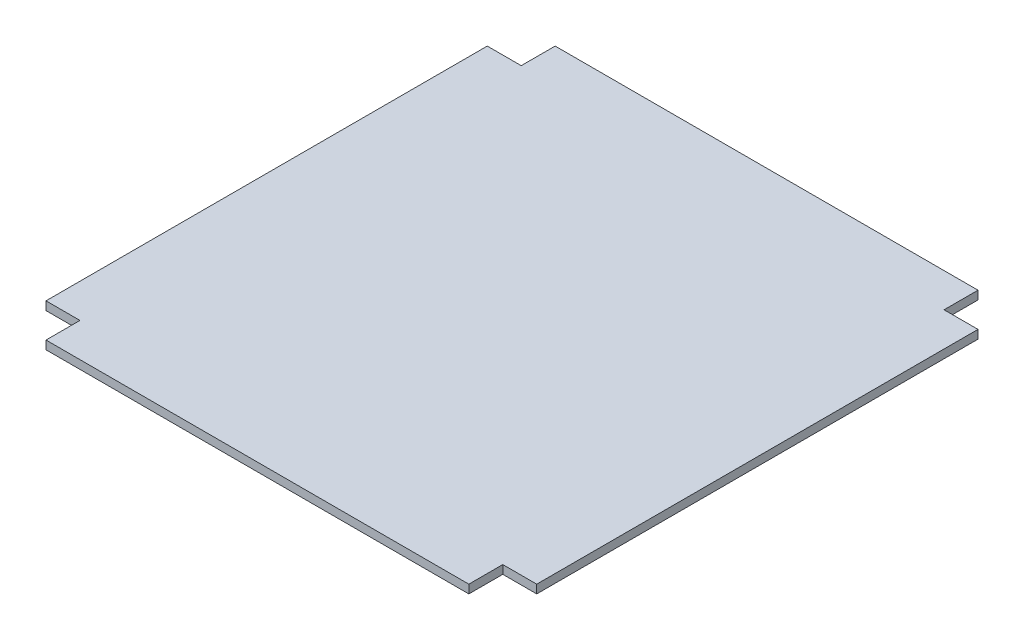
ISO-10303-21;
HEADER;
FILE_DESCRIPTION(('STEP AP214'),'2;1');
FILE_NAME('part.step','',(''),(''),'','','');
FILE_SCHEMA(('AUTOMOTIVE_DESIGN { 1 0 10303 214 1 1 1 1 }'));
ENDSEC;
DATA;
#1=APPLICATION_CONTEXT('core data for automotive mechanical design processes');
#2=APPLICATION_PROTOCOL_DEFINITION('international standard','automotive_design',2000,#1);
#3=PRODUCT_CONTEXT('',#1,'mechanical');
#4=PRODUCT('Part','Part','',(#3));
#5=PRODUCT_RELATED_PRODUCT_CATEGORY('part','',(#4));
#6=PRODUCT_DEFINITION_FORMATION('','',#4);
#7=PRODUCT_DEFINITION_CONTEXT('part definition',#1,'design');
#8=PRODUCT_DEFINITION('design','',#6,#7);
#9=PRODUCT_DEFINITION_SHAPE('','',#8);
#10=(LENGTH_UNIT() NAMED_UNIT(*) SI_UNIT(.MILLI.,.METRE.));
#11=(NAMED_UNIT(*) PLANE_ANGLE_UNIT() SI_UNIT($,.RADIAN.));
#12=(NAMED_UNIT(*) SI_UNIT($,.STERADIAN.) SOLID_ANGLE_UNIT());
#13=UNCERTAINTY_MEASURE_WITH_UNIT(LENGTH_MEASURE(1.E-05),#10,'distance_accuracy_value','');
#14=(GEOMETRIC_REPRESENTATION_CONTEXT(3) GLOBAL_UNCERTAINTY_ASSIGNED_CONTEXT((#13)) GLOBAL_UNIT_ASSIGNED_CONTEXT((#10,
#11,#12)) REPRESENTATION_CONTEXT('',''));
#15=CARTESIAN_POINT('',(0.,0.,0.));
#16=DIRECTION('',(0.,0.,1.));
#17=DIRECTION('',(1.,0.,0.));
#18=AXIS2_PLACEMENT_3D('',#15,#16,#17);
#19=CARTESIAN_POINT('',(-144.56832294801,5.,0.));
#20=DIRECTION('',(-1.,0.,0.));
#21=DIRECTION('',(0.,0.,1.));
#22=AXIS2_PLACEMENT_3D('',#19,#20,#21);
#23=PLANE('',#22);
#24=DIRECTION('',(0.,0.,-1.));
#25=VECTOR('',#24,1.);
#26=CARTESIAN_POINT('',(-144.56832294801,0.,0.));
#27=LINE('',#26,#25);
#28=CARTESIAN_POINT('',(-144.56832294801,0.,130.));
#29=VERTEX_POINT('',#28);
#30=CARTESIAN_POINT('',(-144.56832294801,0.,-130.));
#31=VERTEX_POINT('',#30);
#32=EDGE_CURVE('E163',#29,#31,#27,.T.);
#33=ORIENTED_EDGE('',*,*,#32,.F.);
#34=DIRECTION('',(0.,-1.,0.));
#35=VECTOR('',#34,1.);
#36=CARTESIAN_POINT('',(-144.56832294801,5.,130.));
#37=LINE('',#36,#35);
#38=CARTESIAN_POINT('',(-144.56832294801,5.,130.));
#39=VERTEX_POINT('',#38);
#40=EDGE_CURVE('E11',#39,#29,#37,.T.);
#41=ORIENTED_EDGE('',*,*,#40,.F.);
#42=DIRECTION('',(0.,0.,-1.));
#43=VECTOR('',#42,1.);
#44=CARTESIAN_POINT('',(-144.56832294801,5.,0.));
#45=LINE('',#44,#43);
#46=CARTESIAN_POINT('',(-144.56832294801,5.,-130.));
#47=VERTEX_POINT('',#46);
#48=EDGE_CURVE('E205',#39,#47,#45,.T.);
#49=ORIENTED_EDGE('',*,*,#48,.T.);
#50=DIRECTION('',(0.,-1.,0.));
#51=VECTOR('',#50,1.);
#52=CARTESIAN_POINT('',(-144.56832294801,5.,-130.));
#53=LINE('',#52,#51);
#54=EDGE_CURVE('E58',#47,#31,#53,.T.);
#55=ORIENTED_EDGE('',*,*,#54,.T.);
#56=EDGE_LOOP('',(#33,#41,#49,#55));
#57=FACE_BOUND('',#56,.T.);
#58=ADVANCED_FACE('F41',(#57),#23,.T.);
#59=CARTESIAN_POINT('',(0.,5.,130.));
#60=DIRECTION('',(0.,0.,-1.));
#61=DIRECTION('',(-1.,0.,0.));
#62=AXIS2_PLACEMENT_3D('',#59,#60,#61);
#63=PLANE('',#62);
#64=DIRECTION('',(1.,0.,0.));
#65=VECTOR('',#64,1.);
#66=CARTESIAN_POINT('',(0.,0.,130.));
#67=LINE('',#66,#65);
#68=CARTESIAN_POINT('',(-124.56832294801,0.,130.));
#69=VERTEX_POINT('',#68);
#70=EDGE_CURVE('E166',#29,#69,#67,.T.);
#71=ORIENTED_EDGE('',*,*,#70,.T.);
#72=DIRECTION('',(0.,-1.,0.));
#73=VECTOR('',#72,1.);
#74=CARTESIAN_POINT('',(-124.56832294801,5.,130.));
#75=LINE('',#74,#73);
#76=CARTESIAN_POINT('',(-124.56832294801,5.,130.));
#77=VERTEX_POINT('',#76);
#78=EDGE_CURVE('E50',#77,#69,#75,.T.);
#79=ORIENTED_EDGE('',*,*,#78,.F.);
#80=DIRECTION('',(1.,0.,0.));
#81=VECTOR('',#80,1.);
#82=CARTESIAN_POINT('',(0.,5.,130.));
#83=LINE('',#82,#81);
#84=EDGE_CURVE('E259',#39,#77,#83,.T.);
#85=ORIENTED_EDGE('',*,*,#84,.F.);
#86=ORIENTED_EDGE('',*,*,#40,.T.);
#87=EDGE_LOOP('',(#71,#79,#85,#86));
#88=FACE_BOUND('',#87,.T.);
#89=ADVANCED_FACE('F294',(#88),#63,.F.);
#90=CARTESIAN_POINT('',(-124.56832294801,5.,0.));
#91=DIRECTION('',(1.,0.,0.));
#92=DIRECTION('',(0.,0.,-1.));
#93=AXIS2_PLACEMENT_3D('',#90,#91,#92);
#94=PLANE('',#93);
#95=DIRECTION('',(0.,0.,1.));
#96=VECTOR('',#95,1.);
#97=CARTESIAN_POINT('',(-124.56832294801,0.,0.));
#98=LINE('',#97,#96);
#99=CARTESIAN_POINT('',(-124.56832294801,0.,150.));
#100=VERTEX_POINT('',#99);
#101=EDGE_CURVE('E169',#69,#100,#98,.T.);
#102=ORIENTED_EDGE('',*,*,#101,.T.);
#103=DIRECTION('',(0.,-1.,0.));
#104=VECTOR('',#103,1.);
#105=CARTESIAN_POINT('',(-124.56832294801,5.,150.));
#106=LINE('',#105,#104);
#107=CARTESIAN_POINT('',(-124.56832294801,5.,150.));
#108=VERTEX_POINT('',#107);
#109=EDGE_CURVE('E228',#108,#100,#106,.T.);
#110=ORIENTED_EDGE('',*,*,#109,.F.);
#111=DIRECTION('',(0.,0.,1.));
#112=VECTOR('',#111,1.);
#113=CARTESIAN_POINT('',(-124.56832294801,5.,0.));
#114=LINE('',#113,#112);
#115=EDGE_CURVE('E238',#77,#108,#114,.T.);
#116=ORIENTED_EDGE('',*,*,#115,.F.);
#117=ORIENTED_EDGE('',*,*,#78,.T.);
#118=EDGE_LOOP('',(#102,#110,#116,#117));
#119=FACE_BOUND('',#118,.T.);
#120=ADVANCED_FACE('F236',(#119),#94,.F.);
#121=CARTESIAN_POINT('',(0.,5.,150.));
#122=DIRECTION('',(0.,0.,1.));
#123=DIRECTION('',(1.,0.,0.));
#124=AXIS2_PLACEMENT_3D('',#121,#122,#123);
#125=PLANE('',#124);
#126=DIRECTION('',(-1.,0.,0.));
#127=VECTOR('',#126,1.);
#128=CARTESIAN_POINT('',(0.,0.,150.));
#129=LINE('',#128,#127);
#130=CARTESIAN_POINT('',(124.56832294801,0.,150.));
#131=VERTEX_POINT('',#130);
#132=EDGE_CURVE('E173',#131,#100,#129,.T.);
#133=ORIENTED_EDGE('',*,*,#132,.F.);
#134=DIRECTION('',(0.,-1.,0.));
#135=VECTOR('',#134,1.);
#136=CARTESIAN_POINT('',(124.56832294801,5.,150.));
#137=LINE('',#136,#135);
#138=CARTESIAN_POINT('',(124.56832294801,5.,150.));
#139=VERTEX_POINT('',#138);
#140=EDGE_CURVE('E225',#139,#131,#137,.T.);
#141=ORIENTED_EDGE('',*,*,#140,.F.);
#142=DIRECTION('',(-1.,0.,0.));
#143=VECTOR('',#142,1.);
#144=CARTESIAN_POINT('',(0.,5.,150.));
#145=LINE('',#144,#143);
#146=EDGE_CURVE('E249',#139,#108,#145,.T.);
#147=ORIENTED_EDGE('',*,*,#146,.T.);
#148=ORIENTED_EDGE('',*,*,#109,.T.);
#149=EDGE_LOOP('',(#133,#141,#147,#148));
#150=FACE_BOUND('',#149,.T.);
#151=ADVANCED_FACE('F246',(#150),#125,.T.);
#152=CARTESIAN_POINT('',(124.56832294801,5.,0.));
#153=DIRECTION('',(1.,0.,0.));
#154=DIRECTION('',(0.,0.,-1.));
#155=AXIS2_PLACEMENT_3D('',#152,#153,#154);
#156=PLANE('',#155);
#157=DIRECTION('',(0.,0.,1.));
#158=VECTOR('',#157,1.);
#159=CARTESIAN_POINT('',(124.56832294801,0.,0.));
#160=LINE('',#159,#158);
#161=CARTESIAN_POINT('',(124.56832294801,0.,130.));
#162=VERTEX_POINT('',#161);
#163=EDGE_CURVE('E177',#162,#131,#160,.T.);
#164=ORIENTED_EDGE('',*,*,#163,.F.);
#165=DIRECTION('',(0.,-1.,0.));
#166=VECTOR('',#165,1.);
#167=CARTESIAN_POINT('',(124.56832294801,5.,130.));
#168=LINE('',#167,#166);
#169=CARTESIAN_POINT('',(124.56832294801,5.,130.));
#170=VERTEX_POINT('',#169);
#171=EDGE_CURVE('E222',#170,#162,#168,.T.);
#172=ORIENTED_EDGE('',*,*,#171,.F.);
#173=DIRECTION('',(0.,0.,1.));
#174=VECTOR('',#173,1.);
#175=CARTESIAN_POINT('',(124.56832294801,5.,0.));
#176=LINE('',#175,#174);
#177=EDGE_CURVE('E253',#170,#139,#176,.T.);
#178=ORIENTED_EDGE('',*,*,#177,.T.);
#179=ORIENTED_EDGE('',*,*,#140,.T.);
#180=EDGE_LOOP('',(#164,#172,#178,#179));
#181=FACE_BOUND('',#180,.T.);
#182=ADVANCED_FACE('F305',(#181),#156,.T.);
#183=CARTESIAN_POINT('',(0.,5.,130.));
#184=DIRECTION('',(0.,0.,1.));
#185=DIRECTION('',(1.,0.,0.));
#186=AXIS2_PLACEMENT_3D('',#183,#184,#185);
#187=PLANE('',#186);
#188=DIRECTION('',(-1.,0.,0.));
#189=VECTOR('',#188,1.);
#190=CARTESIAN_POINT('',(0.,0.,130.));
#191=LINE('',#190,#189);
#192=CARTESIAN_POINT('',(144.56832294801,0.,130.));
#193=VERTEX_POINT('',#192);
#194=EDGE_CURVE('E181',#193,#162,#191,.T.);
#195=ORIENTED_EDGE('',*,*,#194,.F.);
#196=DIRECTION('',(0.,-1.,0.));
#197=VECTOR('',#196,1.);
#198=CARTESIAN_POINT('',(144.56832294801,5.,130.));
#199=LINE('',#198,#197);
#200=CARTESIAN_POINT('',(144.56832294801,5.,130.));
#201=VERTEX_POINT('',#200);
#202=EDGE_CURVE('E219',#201,#193,#199,.T.);
#203=ORIENTED_EDGE('',*,*,#202,.F.);
#204=DIRECTION('',(-1.,0.,0.));
#205=VECTOR('',#204,1.);
#206=CARTESIAN_POINT('',(0.,5.,130.));
#207=LINE('',#206,#205);
#208=EDGE_CURVE('E257',#201,#170,#207,.T.);
#209=ORIENTED_EDGE('',*,*,#208,.T.);
#210=ORIENTED_EDGE('',*,*,#171,.T.);
#211=EDGE_LOOP('',(#195,#203,#209,#210));
#212=FACE_BOUND('',#211,.T.);
#213=ADVANCED_FACE('F308',(#212),#187,.T.);
#214=CARTESIAN_POINT('',(144.56832294801,5.,0.));
#215=DIRECTION('',(1.,0.,0.));
#216=DIRECTION('',(0.,0.,-1.));
#217=AXIS2_PLACEMENT_3D('',#214,#215,#216);
#218=PLANE('',#217);
#219=DIRECTION('',(0.,0.,1.));
#220=VECTOR('',#219,1.);
#221=CARTESIAN_POINT('',(144.56832294801,0.,0.));
#222=LINE('',#221,#220);
#223=CARTESIAN_POINT('',(144.56832294801,0.,-130.));
#224=VERTEX_POINT('',#223);
#225=EDGE_CURVE('E185',#224,#193,#222,.T.);
#226=ORIENTED_EDGE('',*,*,#225,.F.);
#227=DIRECTION('',(0.,-1.,0.));
#228=VECTOR('',#227,1.);
#229=CARTESIAN_POINT('',(144.56832294801,5.,-130.));
#230=LINE('',#229,#228);
#231=CARTESIAN_POINT('',(144.56832294801,5.,-130.));
#232=VERTEX_POINT('',#231);
#233=EDGE_CURVE('E216',#232,#224,#230,.T.);
#234=ORIENTED_EDGE('',*,*,#233,.F.);
#235=DIRECTION('',(0.,0.,1.));
#236=VECTOR('',#235,1.);
#237=CARTESIAN_POINT('',(144.56832294801,5.,0.));
#238=LINE('',#237,#236);
#239=EDGE_CURVE('E266',#232,#201,#238,.T.);
#240=ORIENTED_EDGE('',*,*,#239,.T.);
#241=ORIENTED_EDGE('',*,*,#202,.T.);
#242=EDGE_LOOP('',(#226,#234,#240,#241));
#243=FACE_BOUND('',#242,.T.);
#244=ADVANCED_FACE('F312',(#243),#218,.T.);
#245=CARTESIAN_POINT('',(0.,5.,-130.));
#246=DIRECTION('',(0.,0.,1.));
#247=DIRECTION('',(1.,0.,0.));
#248=AXIS2_PLACEMENT_3D('',#245,#246,#247);
#249=PLANE('',#248);
#250=DIRECTION('',(-1.,0.,0.));
#251=VECTOR('',#250,1.);
#252=CARTESIAN_POINT('',(0.,0.,-130.));
#253=LINE('',#252,#251);
#254=CARTESIAN_POINT('',(124.56832294801,0.,-130.));
#255=VERTEX_POINT('',#254);
#256=EDGE_CURVE('E189',#224,#255,#253,.T.);
#257=ORIENTED_EDGE('',*,*,#256,.T.);
#258=DIRECTION('',(0.,-1.,0.));
#259=VECTOR('',#258,1.);
#260=CARTESIAN_POINT('',(124.56832294801,5.,-130.));
#261=LINE('',#260,#259);
#262=CARTESIAN_POINT('',(124.56832294801,5.,-130.));
#263=VERTEX_POINT('',#262);
#264=EDGE_CURVE('E212',#263,#255,#261,.T.);
#265=ORIENTED_EDGE('',*,*,#264,.F.);
#266=DIRECTION('',(-1.,0.,0.));
#267=VECTOR('',#266,1.);
#268=CARTESIAN_POINT('',(0.,5.,-130.));
#269=LINE('',#268,#267);
#270=EDGE_CURVE('E270',#232,#263,#269,.T.);
#271=ORIENTED_EDGE('',*,*,#270,.F.);
#272=ORIENTED_EDGE('',*,*,#233,.T.);
#273=EDGE_LOOP('',(#257,#265,#271,#272));
#274=FACE_BOUND('',#273,.T.);
#275=ADVANCED_FACE('F278',(#274),#249,.F.);
#276=CARTESIAN_POINT('',(124.56832294801,5.,0.));
#277=DIRECTION('',(-1.,0.,0.));
#278=DIRECTION('',(0.,0.,1.));
#279=AXIS2_PLACEMENT_3D('',#276,#277,#278);
#280=PLANE('',#279);
#281=DIRECTION('',(0.,0.,-1.));
#282=VECTOR('',#281,1.);
#283=CARTESIAN_POINT('',(124.56832294801,0.,0.));
#284=LINE('',#283,#282);
#285=CARTESIAN_POINT('',(124.56832294801,0.,-150.));
#286=VERTEX_POINT('',#285);
#287=EDGE_CURVE('E192',#255,#286,#284,.T.);
#288=ORIENTED_EDGE('',*,*,#287,.T.);
#289=DIRECTION('',(0.,-1.,0.));
#290=VECTOR('',#289,1.);
#291=CARTESIAN_POINT('',(124.56832294801,5.,-150.));
#292=LINE('',#291,#290);
#293=CARTESIAN_POINT('',(124.56832294801,5.,-150.));
#294=VERTEX_POINT('',#293);
#295=EDGE_CURVE('E142',#294,#286,#292,.T.);
#296=ORIENTED_EDGE('',*,*,#295,.F.);
#297=DIRECTION('',(0.,0.,-1.));
#298=VECTOR('',#297,1.);
#299=CARTESIAN_POINT('',(124.56832294801,5.,0.));
#300=LINE('',#299,#298);
#301=EDGE_CURVE('E151',#263,#294,#300,.T.);
#302=ORIENTED_EDGE('',*,*,#301,.F.);
#303=ORIENTED_EDGE('',*,*,#264,.T.);
#304=EDGE_LOOP('',(#288,#296,#302,#303));
#305=FACE_BOUND('',#304,.T.);
#306=ADVANCED_FACE('F282',(#305),#280,.F.);
#307=CARTESIAN_POINT('',(0.,5.,-150.));
#308=DIRECTION('',(0.,0.,-1.));
#309=DIRECTION('',(-1.,0.,0.));
#310=AXIS2_PLACEMENT_3D('',#307,#308,#309);
#311=PLANE('',#310);
#312=DIRECTION('',(1.,0.,0.));
#313=VECTOR('',#312,1.);
#314=CARTESIAN_POINT('',(0.,0.,-150.));
#315=LINE('',#314,#313);
#316=CARTESIAN_POINT('',(-124.56832294801,0.,-150.));
#317=VERTEX_POINT('',#316);
#318=EDGE_CURVE('E137',#317,#286,#315,.T.);
#319=ORIENTED_EDGE('',*,*,#318,.F.);
#320=DIRECTION('',(0.,-1.,0.));
#321=VECTOR('',#320,1.);
#322=CARTESIAN_POINT('',(-124.56832294801,5.,-150.));
#323=LINE('',#322,#321);
#324=CARTESIAN_POINT('',(-124.56832294801,5.,-150.));
#325=VERTEX_POINT('',#324);
#326=EDGE_CURVE('E132',#325,#317,#323,.T.);
#327=ORIENTED_EDGE('',*,*,#326,.F.);
#328=DIRECTION('',(1.,0.,0.));
#329=VECTOR('',#328,1.);
#330=CARTESIAN_POINT('',(0.,5.,-150.));
#331=LINE('',#330,#329);
#332=EDGE_CURVE('E135',#325,#294,#331,.T.);
#333=ORIENTED_EDGE('',*,*,#332,.T.);
#334=ORIENTED_EDGE('',*,*,#295,.T.);
#335=EDGE_LOOP('',(#319,#327,#333,#334));
#336=FACE_BOUND('',#335,.T.);
#337=ADVANCED_FACE('F134',(#336),#311,.T.);
#338=CARTESIAN_POINT('',(-124.56832294801,5.,0.));
#339=DIRECTION('',(-1.,0.,0.));
#340=DIRECTION('',(0.,0.,1.));
#341=AXIS2_PLACEMENT_3D('',#338,#339,#340);
#342=PLANE('',#341);
#343=DIRECTION('',(0.,0.,-1.));
#344=VECTOR('',#343,1.);
#345=CARTESIAN_POINT('',(-124.56832294801,0.,0.));
#346=LINE('',#345,#344);
#347=CARTESIAN_POINT('',(-124.56832294801,0.,-130.));
#348=VERTEX_POINT('',#347);
#349=EDGE_CURVE('E198',#348,#317,#346,.T.);
#350=ORIENTED_EDGE('',*,*,#349,.F.);
#351=DIRECTION('',(0.,-1.,0.));
#352=VECTOR('',#351,1.);
#353=CARTESIAN_POINT('',(-124.56832294801,5.,-130.));
#354=LINE('',#353,#352);
#355=CARTESIAN_POINT('',(-124.56832294801,5.,-130.));
#356=VERTEX_POINT('',#355);
#357=EDGE_CURVE('E95',#356,#348,#354,.T.);
#358=ORIENTED_EDGE('',*,*,#357,.F.);
#359=DIRECTION('',(0.,0.,-1.));
#360=VECTOR('',#359,1.);
#361=CARTESIAN_POINT('',(-124.56832294801,5.,0.));
#362=LINE('',#361,#360);
#363=EDGE_CURVE('E149',#356,#325,#362,.T.);
#364=ORIENTED_EDGE('',*,*,#363,.T.);
#365=ORIENTED_EDGE('',*,*,#326,.T.);
#366=EDGE_LOOP('',(#350,#358,#364,#365));
#367=FACE_BOUND('',#366,.T.);
#368=ADVANCED_FACE('F155',(#367),#342,.T.);
#369=CARTESIAN_POINT('',(0.,5.,-130.));
#370=DIRECTION('',(0.,0.,-1.));
#371=DIRECTION('',(-1.,0.,0.));
#372=AXIS2_PLACEMENT_3D('',#369,#370,#371);
#373=PLANE('',#372);
#374=DIRECTION('',(1.,0.,0.));
#375=VECTOR('',#374,1.);
#376=CARTESIAN_POINT('',(0.,0.,-130.));
#377=LINE('',#376,#375);
#378=EDGE_CURVE('E201',#31,#348,#377,.T.);
#379=ORIENTED_EDGE('',*,*,#378,.F.);
#380=ORIENTED_EDGE('',*,*,#54,.F.);
#381=DIRECTION('',(1.,0.,0.));
#382=VECTOR('',#381,1.);
#383=CARTESIAN_POINT('',(0.,5.,-130.));
#384=LINE('',#383,#382);
#385=EDGE_CURVE('E157',#47,#356,#384,.T.);
#386=ORIENTED_EDGE('',*,*,#385,.T.);
#387=ORIENTED_EDGE('',*,*,#357,.T.);
#388=EDGE_LOOP('',(#379,#380,#386,#387));
#389=FACE_BOUND('',#388,.T.);
#390=ADVANCED_FACE('F283',(#389),#373,.T.);
#391=CARTESIAN_POINT('',(0.,5.,0.));
#392=DIRECTION('',(0.,1.,0.));
#393=DIRECTION('',(0.,0.,1.));
#394=AXIS2_PLACEMENT_3D('',#391,#392,#393);
#395=PLANE('',#394);
#396=ORIENTED_EDGE('',*,*,#48,.F.);
#397=ORIENTED_EDGE('',*,*,#84,.T.);
#398=ORIENTED_EDGE('',*,*,#115,.T.);
#399=ORIENTED_EDGE('',*,*,#146,.F.);
#400=ORIENTED_EDGE('',*,*,#177,.F.);
#401=ORIENTED_EDGE('',*,*,#208,.F.);
#402=ORIENTED_EDGE('',*,*,#239,.F.);
#403=ORIENTED_EDGE('',*,*,#270,.T.);
#404=ORIENTED_EDGE('',*,*,#301,.T.);
#405=ORIENTED_EDGE('',*,*,#332,.F.);
#406=ORIENTED_EDGE('',*,*,#363,.F.);
#407=ORIENTED_EDGE('',*,*,#385,.F.);
#408=EDGE_LOOP('',(#396,#397,#398,#399,#400,#401,#402,#403,#404,#405,#406,#407));
#409=FACE_BOUND('',#408,.T.);
#410=ADVANCED_FACE('F147',(#409),#395,.T.);
#411=CARTESIAN_POINT('',(0.,0.,0.));
#412=DIRECTION('',(0.,1.,0.));
#413=DIRECTION('',(0.,0.,1.));
#414=AXIS2_PLACEMENT_3D('',#411,#412,#413);
#415=PLANE('',#414);
#416=ORIENTED_EDGE('',*,*,#32,.T.);
#417=ORIENTED_EDGE('',*,*,#378,.T.);
#418=ORIENTED_EDGE('',*,*,#349,.T.);
#419=ORIENTED_EDGE('',*,*,#318,.T.);
#420=ORIENTED_EDGE('',*,*,#287,.F.);
#421=ORIENTED_EDGE('',*,*,#256,.F.);
#422=ORIENTED_EDGE('',*,*,#225,.T.);
#423=ORIENTED_EDGE('',*,*,#194,.T.);
#424=ORIENTED_EDGE('',*,*,#163,.T.);
#425=ORIENTED_EDGE('',*,*,#132,.T.);
#426=ORIENTED_EDGE('',*,*,#101,.F.);
#427=ORIENTED_EDGE('',*,*,#70,.F.);
#428=EDGE_LOOP('',(#416,#417,#418,#419,#420,#421,#422,#423,#424,#425,#426,#427));
#429=FACE_BOUND('',#428,.T.);
#430=ADVANCED_FACE('F242',(#429),#415,.F.);
#431=CLOSED_SHELL('',(#58,#89,#120,#151,#182,#213,#244,#275,#306,#337,#368,#390,#410,#430));
#432=MANIFOLD_SOLID_BREP('B2',#431);
#433=ADVANCED_BREP_SHAPE_REPRESENTATION('',(#18,#432),#14);
#434=SHAPE_DEFINITION_REPRESENTATION(#9,#433);
ENDSEC;
END-ISO-10303-21;
